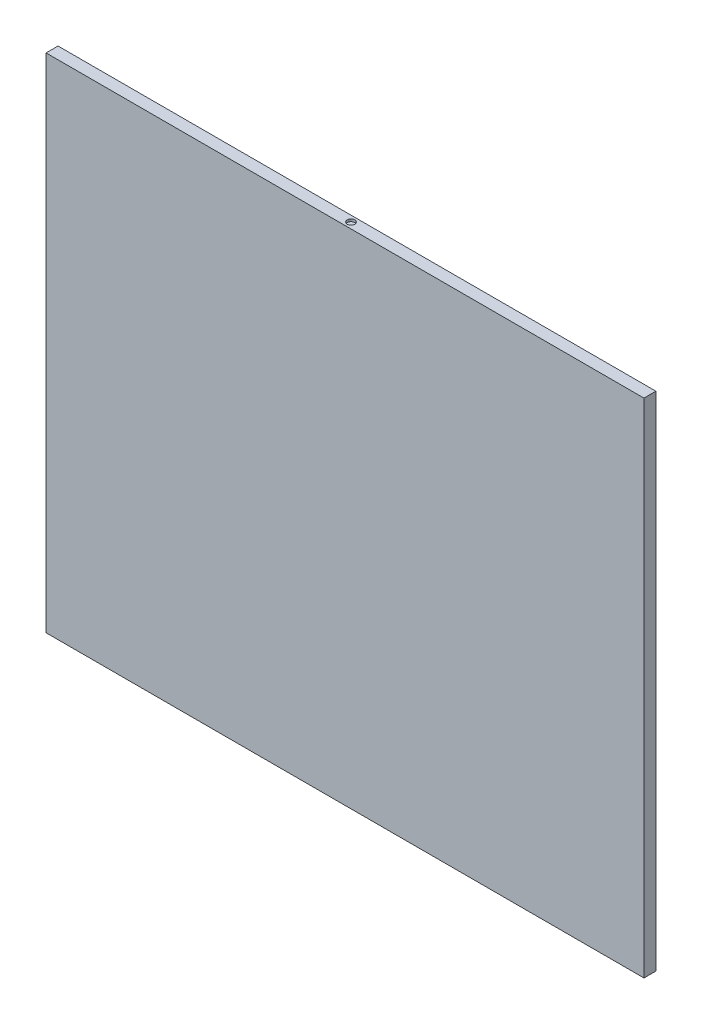
ISO-10303-21;
HEADER;
FILE_DESCRIPTION(('STEP AP214'),'2;1');
FILE_NAME('part.step','',(''),(''),'','','');
FILE_SCHEMA(('AUTOMOTIVE_DESIGN { 1 0 10303 214 1 1 1 1 }'));
ENDSEC;
DATA;
#1=APPLICATION_CONTEXT('core data for automotive mechanical design processes');
#2=APPLICATION_PROTOCOL_DEFINITION('international standard','automotive_design',2000,#1);
#3=PRODUCT_CONTEXT('',#1,'mechanical');
#4=PRODUCT('Part','Part','',(#3));
#5=PRODUCT_RELATED_PRODUCT_CATEGORY('part','',(#4));
#6=PRODUCT_DEFINITION_FORMATION('','',#4);
#7=PRODUCT_DEFINITION_CONTEXT('part definition',#1,'design');
#8=PRODUCT_DEFINITION('design','',#6,#7);
#9=PRODUCT_DEFINITION_SHAPE('','',#8);
#10=(LENGTH_UNIT() NAMED_UNIT(*) SI_UNIT(.MILLI.,.METRE.));
#11=(NAMED_UNIT(*) PLANE_ANGLE_UNIT() SI_UNIT($,.RADIAN.));
#12=(NAMED_UNIT(*) SI_UNIT($,.STERADIAN.) SOLID_ANGLE_UNIT());
#13=UNCERTAINTY_MEASURE_WITH_UNIT(LENGTH_MEASURE(1.E-05),#10,'distance_accuracy_value','');
#14=(GEOMETRIC_REPRESENTATION_CONTEXT(3) GLOBAL_UNCERTAINTY_ASSIGNED_CONTEXT((#13)) GLOBAL_UNIT_ASSIGNED_CONTEXT((#10,
#11,#12)) REPRESENTATION_CONTEXT('',''));
#15=CARTESIAN_POINT('',(0.,0.,0.));
#16=DIRECTION('',(0.,0.,1.));
#17=DIRECTION('',(1.,0.,0.));
#18=AXIS2_PLACEMENT_3D('',#15,#16,#17);
#19=CARTESIAN_POINT('',(125.,-105.,5.));
#20=DIRECTION('',(-1.,0.,0.));
#21=DIRECTION('',(0.,0.,1.));
#22=AXIS2_PLACEMENT_3D('',#19,#20,#21);
#23=PLANE('',#22);
#24=DIRECTION('',(0.,1.,0.));
#25=VECTOR('',#24,1.);
#26=CARTESIAN_POINT('',(125.,-105.,0.));
#27=LINE('',#26,#25);
#28=CARTESIAN_POINT('',(125.,-105.,0.));
#29=VERTEX_POINT('',#28);
#30=CARTESIAN_POINT('',(125.,105.,0.));
#31=VERTEX_POINT('',#30);
#32=EDGE_CURVE('E98',#29,#31,#27,.T.);
#33=ORIENTED_EDGE('',*,*,#32,.T.);
#34=DIRECTION('',(0.,0.,-1.));
#35=VECTOR('',#34,1.);
#36=CARTESIAN_POINT('',(125.,105.,5.));
#37=LINE('',#36,#35);
#38=CARTESIAN_POINT('',(125.,105.,5.));
#39=VERTEX_POINT('',#38);
#40=EDGE_CURVE('E11',#39,#31,#37,.T.);
#41=ORIENTED_EDGE('',*,*,#40,.F.);
#42=DIRECTION('',(0.,1.,0.));
#43=VECTOR('',#42,1.);
#44=CARTESIAN_POINT('',(125.,-105.,5.));
#45=LINE('',#44,#43);
#46=CARTESIAN_POINT('',(125.,-105.,5.));
#47=VERTEX_POINT('',#46);
#48=EDGE_CURVE('E86',#47,#39,#45,.T.);
#49=ORIENTED_EDGE('',*,*,#48,.F.);
#50=DIRECTION('',(0.,0.,-1.));
#51=VECTOR('',#50,1.);
#52=CARTESIAN_POINT('',(125.,-105.,5.));
#53=LINE('',#52,#51);
#54=EDGE_CURVE('E94',#47,#29,#53,.T.);
#55=ORIENTED_EDGE('',*,*,#54,.T.);
#56=EDGE_LOOP('',(#33,#41,#49,#55));
#57=FACE_BOUND('',#56,.T.);
#58=ADVANCED_FACE('F35',(#57),#23,.F.);
#59=CARTESIAN_POINT('',(-125.,105.,5.));
#60=DIRECTION('',(0.,-1.,0.));
#61=DIRECTION('',(0.,0.,-1.));
#62=AXIS2_PLACEMENT_3D('',#59,#60,#61);
#63=PLANE('',#62);
#64=CARTESIAN_POINT('',(0.,105.,2.5));
#65=DIRECTION('',(0.,1.,0.));
#66=DIRECTION('',(0.,0.,1.));
#67=AXIS2_PLACEMENT_3D('',#64,#65,#66);
#68=CIRCLE('',#67,1.58739249298687);
#69=CARTESIAN_POINT('',(0.,105.,4.08739249298687));
#70=VERTEX_POINT('',#69);
#71=EDGE_CURVE('E112',#70,#70,#68,.T.);
#72=ORIENTED_EDGE('',*,*,#71,.F.);
#73=EDGE_LOOP('',(#72));
#74=FACE_BOUND('',#73,.T.);
#75=DIRECTION('',(-1.,0.,0.));
#76=VECTOR('',#75,1.);
#77=CARTESIAN_POINT('',(-125.,105.,0.));
#78=LINE('',#77,#76);
#79=CARTESIAN_POINT('',(-125.,105.,0.));
#80=VERTEX_POINT('',#79);
#81=EDGE_CURVE('E90',#31,#80,#78,.T.);
#82=ORIENTED_EDGE('',*,*,#81,.T.);
#83=DIRECTION('',(0.,0.,-1.));
#84=VECTOR('',#83,1.);
#85=CARTESIAN_POINT('',(-125.,105.,5.));
#86=LINE('',#85,#84);
#87=CARTESIAN_POINT('',(-125.,105.,5.));
#88=VERTEX_POINT('',#87);
#89=EDGE_CURVE('E43',#88,#80,#86,.T.);
#90=ORIENTED_EDGE('',*,*,#89,.F.);
#91=DIRECTION('',(-1.,0.,0.));
#92=VECTOR('',#91,1.);
#93=CARTESIAN_POINT('',(-125.,105.,5.));
#94=LINE('',#93,#92);
#95=EDGE_CURVE('E81',#39,#88,#94,.T.);
#96=ORIENTED_EDGE('',*,*,#95,.F.);
#97=ORIENTED_EDGE('',*,*,#40,.T.);
#98=EDGE_LOOP('',(#82,#90,#96,#97));
#99=FACE_BOUND('',#98,.T.);
#100=ADVANCED_FACE('F89',(#74,#99),#63,.F.);
#101=CARTESIAN_POINT('',(-125.,-105.,5.));
#102=DIRECTION('',(1.,0.,0.));
#103=DIRECTION('',(0.,0.,-1.));
#104=AXIS2_PLACEMENT_3D('',#101,#102,#103);
#105=PLANE('',#104);
#106=DIRECTION('',(0.,-1.,0.));
#107=VECTOR('',#106,1.);
#108=CARTESIAN_POINT('',(-125.,-105.,0.));
#109=LINE('',#108,#107);
#110=CARTESIAN_POINT('',(-125.,-105.,0.));
#111=VERTEX_POINT('',#110);
#112=EDGE_CURVE('E68',#80,#111,#109,.T.);
#113=ORIENTED_EDGE('',*,*,#112,.T.);
#114=DIRECTION('',(0.,0.,-1.));
#115=VECTOR('',#114,1.);
#116=CARTESIAN_POINT('',(-125.,-105.,5.));
#117=LINE('',#116,#115);
#118=CARTESIAN_POINT('',(-125.,-105.,5.));
#119=VERTEX_POINT('',#118);
#120=EDGE_CURVE('E91',#119,#111,#117,.T.);
#121=ORIENTED_EDGE('',*,*,#120,.F.);
#122=DIRECTION('',(0.,-1.,0.));
#123=VECTOR('',#122,1.);
#124=CARTESIAN_POINT('',(-125.,-105.,5.));
#125=LINE('',#124,#123);
#126=EDGE_CURVE('E84',#88,#119,#125,.T.);
#127=ORIENTED_EDGE('',*,*,#126,.F.);
#128=ORIENTED_EDGE('',*,*,#89,.T.);
#129=EDGE_LOOP('',(#113,#121,#127,#128));
#130=FACE_BOUND('',#129,.T.);
#131=ADVANCED_FACE('F92',(#130),#105,.F.);
#132=CARTESIAN_POINT('',(-125.,-105.,5.));
#133=DIRECTION('',(0.,1.,0.));
#134=DIRECTION('',(0.,0.,1.));
#135=AXIS2_PLACEMENT_3D('',#132,#133,#134);
#136=PLANE('',#135);
#137=DIRECTION('',(1.,0.,0.));
#138=VECTOR('',#137,1.);
#139=CARTESIAN_POINT('',(-125.,-105.,0.));
#140=LINE('',#139,#138);
#141=EDGE_CURVE('E74',#111,#29,#140,.T.);
#142=ORIENTED_EDGE('',*,*,#141,.T.);
#143=ORIENTED_EDGE('',*,*,#54,.F.);
#144=DIRECTION('',(1.,0.,0.));
#145=VECTOR('',#144,1.);
#146=CARTESIAN_POINT('',(-125.,-105.,5.));
#147=LINE('',#146,#145);
#148=EDGE_CURVE('E51',#119,#47,#147,.T.);
#149=ORIENTED_EDGE('',*,*,#148,.F.);
#150=ORIENTED_EDGE('',*,*,#120,.T.);
#151=EDGE_LOOP('',(#142,#143,#149,#150));
#152=FACE_BOUND('',#151,.T.);
#153=ADVANCED_FACE('F106',(#152),#136,.F.);
#154=CARTESIAN_POINT('',(0.,0.,5.));
#155=DIRECTION('',(0.,0.,-1.));
#156=DIRECTION('',(-1.,0.,0.));
#157=AXIS2_PLACEMENT_3D('',#154,#155,#156);
#158=PLANE('',#157);
#159=ORIENTED_EDGE('',*,*,#48,.T.);
#160=ORIENTED_EDGE('',*,*,#95,.T.);
#161=ORIENTED_EDGE('',*,*,#126,.T.);
#162=ORIENTED_EDGE('',*,*,#148,.T.);
#163=EDGE_LOOP('',(#159,#160,#161,#162));
#164=FACE_BOUND('',#163,.T.);
#165=ADVANCED_FACE('F82',(#164),#158,.F.);
#166=CARTESIAN_POINT('',(0.,0.,0.));
#167=DIRECTION('',(0.,0.,-1.));
#168=DIRECTION('',(-1.,0.,0.));
#169=AXIS2_PLACEMENT_3D('',#166,#167,#168);
#170=PLANE('',#169);
#171=ORIENTED_EDGE('',*,*,#32,.F.);
#172=ORIENTED_EDGE('',*,*,#141,.F.);
#173=ORIENTED_EDGE('',*,*,#112,.F.);
#174=ORIENTED_EDGE('',*,*,#81,.F.);
#175=EDGE_LOOP('',(#171,#172,#173,#174));
#176=FACE_BOUND('',#175,.T.);
#177=ADVANCED_FACE('F109',(#176),#170,.T.);
#178=CARTESIAN_POINT('',(0.,104.,2.5));
#179=DIRECTION('',(0.,1.,0.));
#180=DIRECTION('',(0.,0.,1.));
#181=AXIS2_PLACEMENT_3D('',#178,#179,#180);
#182=CYLINDRICAL_SURFACE('',#181,1.58739249298687);
#183=CARTESIAN_POINT('',(0.,104.,2.5));
#184=DIRECTION('',(0.,1.,0.));
#185=DIRECTION('',(0.,0.,1.));
#186=AXIS2_PLACEMENT_3D('',#183,#184,#185);
#187=CIRCLE('',#186,1.58739249298687);
#188=CARTESIAN_POINT('',(0.,104.,4.08739249298687));
#189=VERTEX_POINT('',#188);
#190=EDGE_CURVE('E101',#189,#189,#187,.T.);
#191=ORIENTED_EDGE('',*,*,#190,.F.);
#192=EDGE_LOOP('',(#191));
#193=FACE_BOUND('',#192,.T.);
#194=ORIENTED_EDGE('',*,*,#71,.T.);
#195=EDGE_LOOP('',(#194));
#196=FACE_BOUND('',#195,.T.);
#197=ADVANCED_FACE('F120',(#193,#196),#182,.F.);
#198=CARTESIAN_POINT('',(0.,104.,0.));
#199=DIRECTION('',(0.,1.,0.));
#200=DIRECTION('',(0.,0.,1.));
#201=AXIS2_PLACEMENT_3D('',#198,#199,#200);
#202=PLANE('',#201);
#203=ORIENTED_EDGE('',*,*,#190,.T.);
#204=EDGE_LOOP('',(#203));
#205=FACE_BOUND('',#204,.T.);
#206=ADVANCED_FACE('F118',(#205),#202,.T.);
#207=CLOSED_SHELL('',(#58,#100,#131,#153,#165,#177,#197,#206));
#208=MANIFOLD_SOLID_BREP('B2',#207);
#209=ADVANCED_BREP_SHAPE_REPRESENTATION('',(#18,#208),#14);
#210=SHAPE_DEFINITION_REPRESENTATION(#9,#209);
ENDSEC;
END-ISO-10303-21;
